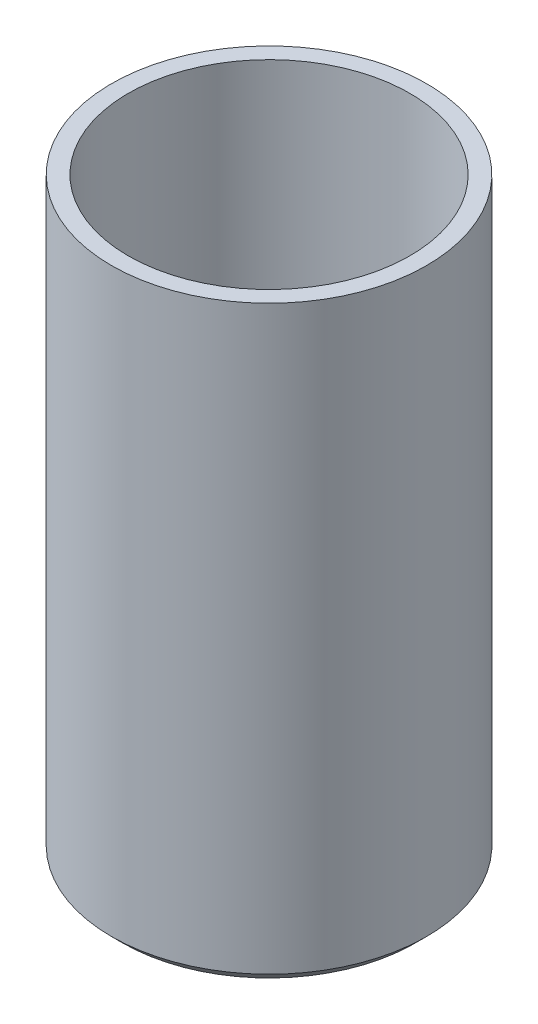
ISO-10303-21;
HEADER;
FILE_DESCRIPTION(('STEP AP214'),'2;1');
FILE_NAME('part.step','',(''),(''),'','','');
FILE_SCHEMA(('AUTOMOTIVE_DESIGN { 1 0 10303 214 1 1 1 1 }'));
ENDSEC;
DATA;
#1=APPLICATION_CONTEXT('core data for automotive mechanical design processes');
#2=APPLICATION_PROTOCOL_DEFINITION('international standard','automotive_design',2000,#1);
#3=PRODUCT_CONTEXT('',#1,'mechanical');
#4=PRODUCT('Part','Part','',(#3));
#5=PRODUCT_RELATED_PRODUCT_CATEGORY('part','',(#4));
#6=PRODUCT_DEFINITION_FORMATION('','',#4);
#7=PRODUCT_DEFINITION_CONTEXT('part definition',#1,'design');
#8=PRODUCT_DEFINITION('design','',#6,#7);
#9=PRODUCT_DEFINITION_SHAPE('','',#8);
#10=(LENGTH_UNIT() NAMED_UNIT(*) SI_UNIT(.MILLI.,.METRE.));
#11=(NAMED_UNIT(*) PLANE_ANGLE_UNIT() SI_UNIT($,.RADIAN.));
#12=(NAMED_UNIT(*) SI_UNIT($,.STERADIAN.) SOLID_ANGLE_UNIT());
#13=UNCERTAINTY_MEASURE_WITH_UNIT(LENGTH_MEASURE(1.E-05),#10,'distance_accuracy_value','');
#14=(GEOMETRIC_REPRESENTATION_CONTEXT(3) GLOBAL_UNCERTAINTY_ASSIGNED_CONTEXT((#13)) GLOBAL_UNIT_ASSIGNED_CONTEXT((#10,
#11,#12)) REPRESENTATION_CONTEXT('',''));
#15=CARTESIAN_POINT('',(0.,0.,0.));
#16=DIRECTION('',(0.,0.,1.));
#17=DIRECTION('',(1.,0.,0.));
#18=AXIS2_PLACEMENT_3D('',#15,#16,#17);
#19=CARTESIAN_POINT('',(0.,3.,0.));
#20=DIRECTION('',(0.,-1.,0.));
#21=DIRECTION('',(0.,0.,-1.));
#22=AXIS2_PLACEMENT_3D('',#19,#20,#21);
#23=CYLINDRICAL_SURFACE('',#22,14.1);
#24=CARTESIAN_POINT('',(0.,0.999999999999999,0.));
#25=DIRECTION('',(0.,1.,0.));
#26=DIRECTION('',(0.,0.,1.));
#27=AXIS2_PLACEMENT_3D('',#24,#25,#26);
#28=CIRCLE('',#27,14.1);
#29=CARTESIAN_POINT('',(0.,0.999999999999999,14.1));
#30=VERTEX_POINT('',#29);
#31=EDGE_CURVE('E38',#30,#30,#28,.T.);
#32=ORIENTED_EDGE('',*,*,#31,.T.);
#33=EDGE_LOOP('',(#32));
#34=FACE_BOUND('',#33,.T.);
#35=CARTESIAN_POINT('',(0.,53.,0.));
#36=DIRECTION('',(0.,1.,0.));
#37=DIRECTION('',(0.,0.,1.));
#38=AXIS2_PLACEMENT_3D('',#35,#36,#37);
#39=CIRCLE('',#38,14.1);
#40=CARTESIAN_POINT('',(0.,53.,14.1));
#41=VERTEX_POINT('',#40);
#42=EDGE_CURVE('E46',#41,#41,#39,.T.);
#43=ORIENTED_EDGE('',*,*,#42,.F.);
#44=EDGE_LOOP('',(#43));
#45=FACE_BOUND('',#44,.T.);
#46=ADVANCED_FACE('F31',(#34,#45),#23,.T.);
#47=CARTESIAN_POINT('',(0.,0.,0.));
#48=DIRECTION('',(0.,1.,0.));
#49=DIRECTION('',(0.,0.,1.));
#50=AXIS2_PLACEMENT_3D('',#47,#48,#49);
#51=PLANE('',#50);
#52=CARTESIAN_POINT('',(0.,0.,0.));
#53=DIRECTION('',(0.,1.,0.));
#54=DIRECTION('',(0.,0.,1.));
#55=AXIS2_PLACEMENT_3D('',#52,#53,#54);
#56=CIRCLE('',#55,13.1);
#57=CARTESIAN_POINT('',(0.,0.,13.1));
#58=VERTEX_POINT('',#57);
#59=EDGE_CURVE('E10',#58,#58,#56,.F.);
#60=ORIENTED_EDGE('',*,*,#59,.T.);
#61=EDGE_LOOP('',(#60));
#62=FACE_BOUND('',#61,.T.);
#63=ADVANCED_FACE('F60',(#62),#51,.F.);
#64=CARTESIAN_POINT('',(0.,53.,0.));
#65=DIRECTION('',(0.,1.,0.));
#66=DIRECTION('',(0.,0.,1.));
#67=AXIS2_PLACEMENT_3D('',#64,#65,#66);
#68=PLANE('',#67);
#69=ORIENTED_EDGE('',*,*,#42,.T.);
#70=EDGE_LOOP('',(#69));
#71=FACE_BOUND('',#70,.T.);
#72=CARTESIAN_POINT('',(0.,53.,0.));
#73=DIRECTION('',(0.,1.,0.));
#74=DIRECTION('',(0.,0.,1.));
#75=AXIS2_PLACEMENT_3D('',#72,#73,#74);
#76=CIRCLE('',#75,12.6);
#77=CARTESIAN_POINT('',(0.,53.,12.6));
#78=VERTEX_POINT('',#77);
#79=EDGE_CURVE('E51',#78,#78,#76,.T.);
#80=ORIENTED_EDGE('',*,*,#79,.F.);
#81=EDGE_LOOP('',(#80));
#82=FACE_BOUND('',#81,.T.);
#83=ADVANCED_FACE('F58',(#71,#82),#68,.T.);
#84=CARTESIAN_POINT('',(0.,53.,0.));
#85=DIRECTION('',(0.,-1.,0.));
#86=DIRECTION('',(0.,0.,-1.));
#87=AXIS2_PLACEMENT_3D('',#84,#85,#86);
#88=CYLINDRICAL_SURFACE('',#87,12.6);
#89=ORIENTED_EDGE('',*,*,#79,.T.);
#90=EDGE_LOOP('',(#89));
#91=FACE_BOUND('',#90,.T.);
#92=CARTESIAN_POINT('',(0.,3.,0.));
#93=DIRECTION('',(0.,1.,0.));
#94=DIRECTION('',(0.,0.,1.));
#95=AXIS2_PLACEMENT_3D('',#92,#93,#94);
#96=CIRCLE('',#95,12.6);
#97=CARTESIAN_POINT('',(0.,3.,12.6));
#98=VERTEX_POINT('',#97);
#99=EDGE_CURVE('E42',#98,#98,#96,.F.);
#100=ORIENTED_EDGE('',*,*,#99,.T.);
#101=EDGE_LOOP('',(#100));
#102=FACE_BOUND('',#101,.T.);
#103=ADVANCED_FACE('F55',(#91,#102),#88,.F.);
#104=CARTESIAN_POINT('',(0.,3.,0.));
#105=DIRECTION('',(0.,1.,0.));
#106=DIRECTION('',(0.,0.,1.));
#107=AXIS2_PLACEMENT_3D('',#104,#105,#106);
#108=PLANE('',#107);
#109=ORIENTED_EDGE('',*,*,#99,.F.);
#110=EDGE_LOOP('',(#109));
#111=FACE_BOUND('',#110,.T.);
#112=ADVANCED_FACE('F67',(#111),#108,.T.);
#113=CARTESIAN_POINT('',(0.,0.999999999999999,0.));
#114=DIRECTION('',(0.,1.,0.));
#115=DIRECTION('',(0.,0.,1.));
#116=AXIS2_PLACEMENT_3D('',#113,#114,#115);
#117=CONICAL_SURFACE('',#116,14.1,0.785398163397452);
#118=ORIENTED_EDGE('',*,*,#59,.F.);
#119=EDGE_LOOP('',(#118));
#120=FACE_BOUND('',#119,.T.);
#121=ORIENTED_EDGE('',*,*,#31,.F.);
#122=EDGE_LOOP('',(#121));
#123=FACE_BOUND('',#122,.T.);
#124=ADVANCED_FACE('F33',(#120,#123),#117,.T.);
#125=CLOSED_SHELL('',(#46,#63,#83,#103,#112,#124));
#126=MANIFOLD_SOLID_BREP('B2',#125);
#127=ADVANCED_BREP_SHAPE_REPRESENTATION('',(#18,#126),#14);
#128=SHAPE_DEFINITION_REPRESENTATION(#9,#127);
ENDSEC;
END-ISO-10303-21;
